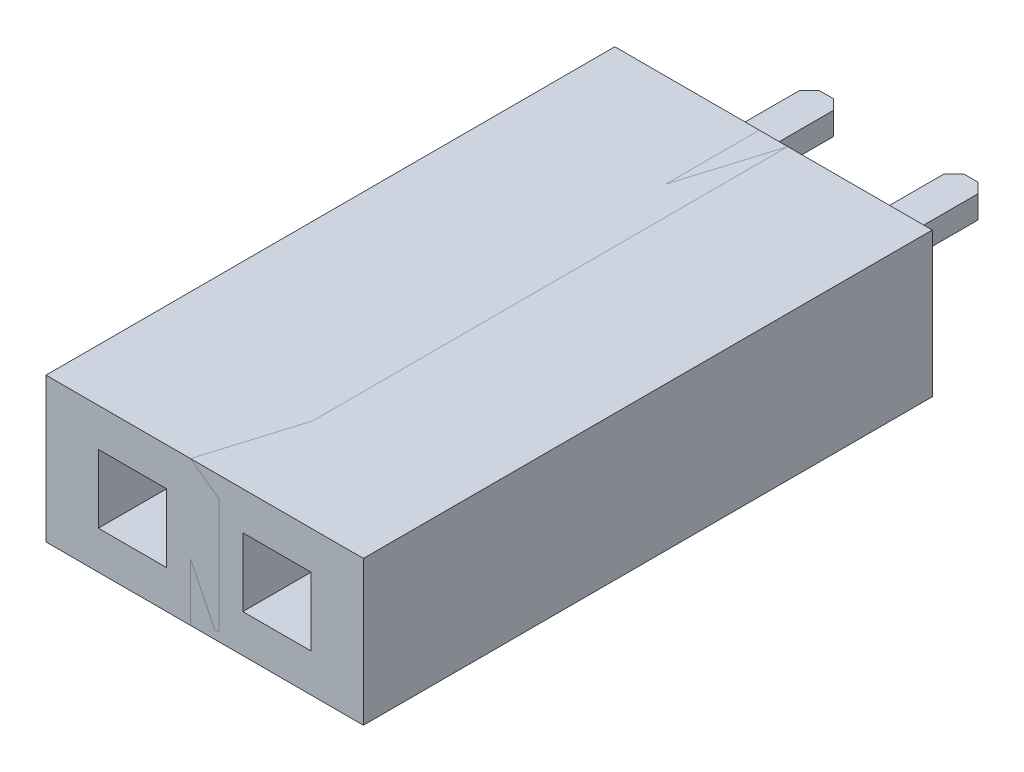
ISO-10303-21;
HEADER;
FILE_DESCRIPTION(('STEP AP214'),'2;1');
FILE_NAME('part.step','',(''),(''),'','','');
FILE_SCHEMA(('AUTOMOTIVE_DESIGN { 1 0 10303 214 1 1 1 1 }'));
ENDSEC;
DATA;
#1=APPLICATION_CONTEXT('core data for automotive mechanical design processes');
#2=APPLICATION_PROTOCOL_DEFINITION('international standard','automotive_design',2000,#1);
#3=PRODUCT_CONTEXT('',#1,'mechanical');
#4=PRODUCT('Part','Part','',(#3));
#5=PRODUCT_RELATED_PRODUCT_CATEGORY('part','',(#4));
#6=PRODUCT_DEFINITION_FORMATION('','',#4);
#7=PRODUCT_DEFINITION_CONTEXT('part definition',#1,'design');
#8=PRODUCT_DEFINITION('design','',#6,#7);
#9=PRODUCT_DEFINITION_SHAPE('','',#8);
#10=(LENGTH_UNIT() NAMED_UNIT(*) SI_UNIT(.MILLI.,.METRE.));
#11=(NAMED_UNIT(*) PLANE_ANGLE_UNIT() SI_UNIT($,.RADIAN.));
#12=(NAMED_UNIT(*) SI_UNIT($,.STERADIAN.) SOLID_ANGLE_UNIT());
#13=UNCERTAINTY_MEASURE_WITH_UNIT(LENGTH_MEASURE(1.E-05),#10,'distance_accuracy_value','');
#14=(GEOMETRIC_REPRESENTATION_CONTEXT(3) GLOBAL_UNCERTAINTY_ASSIGNED_CONTEXT((#13)) GLOBAL_UNIT_ASSIGNED_CONTEXT((#10,
#11,#12)) REPRESENTATION_CONTEXT('',''));
#15=CARTESIAN_POINT('',(0.,0.,0.));
#16=DIRECTION('',(0.,0.,1.));
#17=DIRECTION('',(1.,0.,0.));
#18=AXIS2_PLACEMENT_3D('',#15,#16,#17);
#19=CARTESIAN_POINT('',(4.06,-1.27,0.));
#20=DIRECTION('',(0.,1.,0.));
#21=DIRECTION('',(0.,0.,1.));
#22=AXIS2_PLACEMENT_3D('',#19,#20,#21);
#23=PLANE('',#22);
#24=DIRECTION('',(0.,0.,-1.));
#25=VECTOR('',#24,1.);
#26=CARTESIAN_POINT('',(1.02,-1.27,0.));
#27=LINE('',#26,#25);
#28=CARTESIAN_POINT('',(1.02,-1.27,10.));
#29=VERTEX_POINT('',#28);
#30=CARTESIAN_POINT('',(1.02,-1.27,0.));
#31=VERTEX_POINT('',#30);
#32=EDGE_CURVE('E201',#29,#31,#27,.T.);
#33=ORIENTED_EDGE('',*,*,#32,.T.);
#34=DIRECTION('',(-1.,0.,0.));
#35=VECTOR('',#34,1.);
#36=CARTESIAN_POINT('',(4.06,-1.27,0.));
#37=LINE('',#36,#35);
#38=CARTESIAN_POINT('',(4.06,-1.27,0.));
#39=VERTEX_POINT('',#38);
#40=EDGE_CURVE('E12',#39,#31,#37,.T.);
#41=ORIENTED_EDGE('',*,*,#40,.F.);
#42=DIRECTION('',(0.,0.,-1.));
#43=VECTOR('',#42,1.);
#44=CARTESIAN_POINT('',(4.06,-1.27,0.));
#45=LINE('',#44,#43);
#46=CARTESIAN_POINT('',(4.06,-1.27,10.));
#47=VERTEX_POINT('',#46);
#48=EDGE_CURVE('E207',#47,#39,#45,.T.);
#49=ORIENTED_EDGE('',*,*,#48,.F.);
#50=DIRECTION('',(-1.,0.,0.));
#51=VECTOR('',#50,1.);
#52=CARTESIAN_POINT('',(4.06,-1.27,10.));
#53=LINE('',#52,#51);
#54=EDGE_CURVE('E217',#47,#29,#53,.T.);
#55=ORIENTED_EDGE('',*,*,#54,.T.);
#56=EDGE_LOOP('',(#33,#41,#49,#55));
#57=FACE_BOUND('',#56,.T.);
#58=ADVANCED_FACE('F47',(#57),#23,.F.);
#59=CARTESIAN_POINT('',(4.06,1.27,0.));
#60=DIRECTION('',(0.,0.,1.));
#61=DIRECTION('',(1.,0.,0.));
#62=AXIS2_PLACEMENT_3D('',#59,#60,#61);
#63=PLANE('',#62);
#64=DIRECTION('',(0.,-1.,0.));
#65=VECTOR('',#64,1.);
#66=CARTESIAN_POINT('',(2.24,0.2,0.));
#67=LINE('',#66,#65);
#68=CARTESIAN_POINT('',(2.24,0.2,0.));
#69=VERTEX_POINT('',#68);
#70=CARTESIAN_POINT('',(2.24,-0.2,0.));
#71=VERTEX_POINT('',#70);
#72=EDGE_CURVE('E425',#69,#71,#67,.T.);
#73=ORIENTED_EDGE('',*,*,#72,.T.);
#74=DIRECTION('',(1.,0.,0.));
#75=VECTOR('',#74,1.);
#76=CARTESIAN_POINT('',(2.24,-0.2,0.));
#77=LINE('',#76,#75);
#78=CARTESIAN_POINT('',(2.84,-0.2,0.));
#79=VERTEX_POINT('',#78);
#80=EDGE_CURVE('E61',#71,#79,#77,.T.);
#81=ORIENTED_EDGE('',*,*,#80,.T.);
#82=DIRECTION('',(0.,-1.,0.));
#83=VECTOR('',#82,1.);
#84=CARTESIAN_POINT('',(2.84,0.2,0.));
#85=LINE('',#84,#83);
#86=CARTESIAN_POINT('',(2.84,0.2,0.));
#87=VERTEX_POINT('',#86);
#88=EDGE_CURVE('E152',#87,#79,#85,.T.);
#89=ORIENTED_EDGE('',*,*,#88,.F.);
#90=DIRECTION('',(1.,0.,0.));
#91=VECTOR('',#90,1.);
#92=CARTESIAN_POINT('',(2.24,0.2,0.));
#93=LINE('',#92,#91);
#94=EDGE_CURVE('E158',#69,#87,#93,.T.);
#95=ORIENTED_EDGE('',*,*,#94,.F.);
#96=EDGE_LOOP('',(#73,#81,#89,#95));
#97=FACE_BOUND('',#96,.T.);
#98=DIRECTION('',(0.,1.,0.));
#99=VECTOR('',#98,1.);
#100=CARTESIAN_POINT('',(1.02,1.27,0.));
#101=LINE('',#100,#99);
#102=CARTESIAN_POINT('',(1.02,1.27,0.));
#103=VERTEX_POINT('',#102);
#104=EDGE_CURVE('E220',#31,#103,#101,.T.);
#105=ORIENTED_EDGE('',*,*,#104,.T.);
#106=DIRECTION('',(-1.,0.,0.));
#107=VECTOR('',#106,1.);
#108=CARTESIAN_POINT('',(4.06,1.27,0.));
#109=LINE('',#108,#107);
#110=CARTESIAN_POINT('',(4.06,1.27,0.));
#111=VERTEX_POINT('',#110);
#112=EDGE_CURVE('E54',#111,#103,#109,.T.);
#113=ORIENTED_EDGE('',*,*,#112,.F.);
#114=DIRECTION('',(0.,1.,0.));
#115=VECTOR('',#114,1.);
#116=CARTESIAN_POINT('',(4.06,1.27,0.));
#117=LINE('',#116,#115);
#118=EDGE_CURVE('E210',#39,#111,#117,.T.);
#119=ORIENTED_EDGE('',*,*,#118,.F.);
#120=ORIENTED_EDGE('',*,*,#40,.T.);
#121=EDGE_LOOP('',(#105,#113,#119,#120));
#122=FACE_BOUND('',#121,.T.);
#123=ADVANCED_FACE('F169',(#97,#122),#63,.F.);
#124=CARTESIAN_POINT('',(4.06,1.27,0.));
#125=DIRECTION('',(0.,-1.,0.));
#126=DIRECTION('',(0.,0.,-1.));
#127=AXIS2_PLACEMENT_3D('',#124,#125,#126);
#128=PLANE('',#127);
#129=DIRECTION('',(0.,0.,1.));
#130=VECTOR('',#129,1.);
#131=CARTESIAN_POINT('',(1.02,1.27,0.));
#132=LINE('',#131,#130);
#133=CARTESIAN_POINT('',(1.02,1.27,10.));
#134=VERTEX_POINT('',#133);
#135=EDGE_CURVE('E222',#103,#134,#132,.T.);
#136=ORIENTED_EDGE('',*,*,#135,.T.);
#137=DIRECTION('',(-1.,0.,0.));
#138=VECTOR('',#137,1.);
#139=CARTESIAN_POINT('',(4.06,1.27,10.));
#140=LINE('',#139,#138);
#141=CARTESIAN_POINT('',(4.06,1.27,10.));
#142=VERTEX_POINT('',#141);
#143=EDGE_CURVE('E227',#142,#134,#140,.T.);
#144=ORIENTED_EDGE('',*,*,#143,.F.);
#145=DIRECTION('',(0.,0.,1.));
#146=VECTOR('',#145,1.);
#147=CARTESIAN_POINT('',(4.06,1.27,0.));
#148=LINE('',#147,#146);
#149=EDGE_CURVE('E213',#111,#142,#148,.T.);
#150=ORIENTED_EDGE('',*,*,#149,.F.);
#151=ORIENTED_EDGE('',*,*,#112,.T.);
#152=EDGE_LOOP('',(#136,#144,#150,#151));
#153=FACE_BOUND('',#152,.T.);
#154=ADVANCED_FACE('F234',(#153),#128,.F.);
#155=CARTESIAN_POINT('',(4.06,1.27,10.));
#156=DIRECTION('',(0.,0.,-1.));
#157=DIRECTION('',(-1.,0.,0.));
#158=AXIS2_PLACEMENT_3D('',#155,#156,#157);
#159=PLANE('',#158);
#160=DIRECTION('',(1.,0.,0.));
#161=VECTOR('',#160,1.);
#162=CARTESIAN_POINT('',(3.14,-0.6,10.));
#163=LINE('',#162,#161);
#164=CARTESIAN_POINT('',(1.94,-0.6,10.));
#165=VERTEX_POINT('',#164);
#166=CARTESIAN_POINT('',(3.14,-0.6,10.));
#167=VERTEX_POINT('',#166);
#168=EDGE_CURVE('E172',#165,#167,#163,.T.);
#169=ORIENTED_EDGE('',*,*,#168,.F.);
#170=DIRECTION('',(0.,-1.,0.));
#171=VECTOR('',#170,1.);
#172=CARTESIAN_POINT('',(1.94,-0.6,10.));
#173=LINE('',#172,#171);
#174=CARTESIAN_POINT('',(1.94,0.6,10.));
#175=VERTEX_POINT('',#174);
#176=EDGE_CURVE('E69',#175,#165,#173,.T.);
#177=ORIENTED_EDGE('',*,*,#176,.F.);
#178=DIRECTION('',(-1.,0.,0.));
#179=VECTOR('',#178,1.);
#180=CARTESIAN_POINT('',(3.14,0.6,10.));
#181=LINE('',#180,#179);
#182=CARTESIAN_POINT('',(3.14,0.6,10.));
#183=VERTEX_POINT('',#182);
#184=EDGE_CURVE('E182',#183,#175,#181,.T.);
#185=ORIENTED_EDGE('',*,*,#184,.F.);
#186=DIRECTION('',(0.,1.,0.));
#187=VECTOR('',#186,1.);
#188=CARTESIAN_POINT('',(3.14,-0.6,10.));
#189=LINE('',#188,#187);
#190=EDGE_CURVE('E194',#167,#183,#189,.T.);
#191=ORIENTED_EDGE('',*,*,#190,.F.);
#192=EDGE_LOOP('',(#169,#177,#185,#191));
#193=FACE_BOUND('',#192,.T.);
#194=DIRECTION('',(0.,-1.,0.));
#195=VECTOR('',#194,1.);
#196=CARTESIAN_POINT('',(1.02,1.27,10.));
#197=LINE('',#196,#195);
#198=EDGE_CURVE('E211',#134,#29,#197,.T.);
#199=ORIENTED_EDGE('',*,*,#198,.T.);
#200=ORIENTED_EDGE('',*,*,#54,.F.);
#201=DIRECTION('',(0.,-1.,0.));
#202=VECTOR('',#201,1.);
#203=CARTESIAN_POINT('',(4.06,1.27,10.));
#204=LINE('',#203,#202);
#205=EDGE_CURVE('E215',#142,#47,#204,.T.);
#206=ORIENTED_EDGE('',*,*,#205,.F.);
#207=ORIENTED_EDGE('',*,*,#143,.T.);
#208=EDGE_LOOP('',(#199,#200,#206,#207));
#209=FACE_BOUND('',#208,.T.);
#210=ADVANCED_FACE('F242',(#193,#209),#159,.F.);
#211=CARTESIAN_POINT('',(4.06,0.,0.));
#212=DIRECTION('',(1.,0.,0.));
#213=DIRECTION('',(0.,0.,-1.));
#214=AXIS2_PLACEMENT_3D('',#211,#212,#213);
#215=PLANE('',#214);
#216=ORIENTED_EDGE('',*,*,#48,.T.);
#217=ORIENTED_EDGE('',*,*,#118,.T.);
#218=ORIENTED_EDGE('',*,*,#149,.T.);
#219=ORIENTED_EDGE('',*,*,#205,.T.);
#220=EDGE_LOOP('',(#216,#217,#218,#219));
#221=FACE_BOUND('',#220,.T.);
#222=ADVANCED_FACE('F248',(#221),#215,.T.);
#223=CARTESIAN_POINT('',(1.02,0.,0.));
#224=DIRECTION('',(1.,0.,0.));
#225=DIRECTION('',(0.,0.,-1.));
#226=AXIS2_PLACEMENT_3D('',#223,#224,#225);
#227=PLANE('',#226);
#228=ORIENTED_EDGE('',*,*,#32,.F.);
#229=ORIENTED_EDGE('',*,*,#198,.F.);
#230=ORIENTED_EDGE('',*,*,#135,.F.);
#231=ORIENTED_EDGE('',*,*,#104,.F.);
#232=EDGE_LOOP('',(#228,#229,#230,#231));
#233=FACE_BOUND('',#232,.T.);
#234=ADVANCED_FACE('F239',(#233),#227,.F.);
#235=CARTESIAN_POINT('',(1.94,-0.6,3.));
#236=DIRECTION('',(-1.,0.,0.));
#237=DIRECTION('',(0.,-1.,0.));
#238=AXIS2_PLACEMENT_3D('',#235,#236,#237);
#239=PLANE('',#238);
#240=ORIENTED_EDGE('',*,*,#176,.T.);
#241=DIRECTION('',(0.,0.,1.));
#242=VECTOR('',#241,1.);
#243=CARTESIAN_POINT('',(1.94,-0.6,3.));
#244=LINE('',#243,#242);
#245=CARTESIAN_POINT('',(1.94,-0.6,3.));
#246=VERTEX_POINT('',#245);
#247=EDGE_CURVE('E190',#246,#165,#244,.T.);
#248=ORIENTED_EDGE('',*,*,#247,.F.);
#249=DIRECTION('',(0.,-1.,0.));
#250=VECTOR('',#249,1.);
#251=CARTESIAN_POINT('',(1.94,-0.6,3.));
#252=LINE('',#251,#250);
#253=CARTESIAN_POINT('',(1.94,0.6,3.));
#254=VERTEX_POINT('',#253);
#255=EDGE_CURVE('E178',#254,#246,#252,.T.);
#256=ORIENTED_EDGE('',*,*,#255,.F.);
#257=DIRECTION('',(0.,0.,1.));
#258=VECTOR('',#257,1.);
#259=CARTESIAN_POINT('',(1.94,0.6,3.));
#260=LINE('',#259,#258);
#261=EDGE_CURVE('E199',#254,#175,#260,.T.);
#262=ORIENTED_EDGE('',*,*,#261,.T.);
#263=EDGE_LOOP('',(#240,#248,#256,#262));
#264=FACE_BOUND('',#263,.T.);
#265=ADVANCED_FACE('F261',(#264),#239,.F.);
#266=CARTESIAN_POINT('',(3.14,0.6,3.));
#267=DIRECTION('',(0.,1.,0.));
#268=DIRECTION('',(-1.,0.,0.));
#269=AXIS2_PLACEMENT_3D('',#266,#267,#268);
#270=PLANE('',#269);
#271=ORIENTED_EDGE('',*,*,#184,.T.);
#272=ORIENTED_EDGE('',*,*,#261,.F.);
#273=DIRECTION('',(-1.,0.,0.));
#274=VECTOR('',#273,1.);
#275=CARTESIAN_POINT('',(3.14,0.6,3.));
#276=LINE('',#275,#274);
#277=CARTESIAN_POINT('',(3.14,0.6,3.));
#278=VERTEX_POINT('',#277);
#279=EDGE_CURVE('E188',#278,#254,#276,.T.);
#280=ORIENTED_EDGE('',*,*,#279,.F.);
#281=DIRECTION('',(0.,0.,1.));
#282=VECTOR('',#281,1.);
#283=CARTESIAN_POINT('',(3.14,0.6,3.));
#284=LINE('',#283,#282);
#285=EDGE_CURVE('E202',#278,#183,#284,.T.);
#286=ORIENTED_EDGE('',*,*,#285,.T.);
#287=EDGE_LOOP('',(#271,#272,#280,#286));
#288=FACE_BOUND('',#287,.T.);
#289=ADVANCED_FACE('F266',(#288),#270,.F.);
#290=CARTESIAN_POINT('',(3.14,-0.6,3.));
#291=DIRECTION('',(1.,0.,0.));
#292=DIRECTION('',(0.,1.,0.));
#293=AXIS2_PLACEMENT_3D('',#290,#291,#292);
#294=PLANE('',#293);
#295=ORIENTED_EDGE('',*,*,#190,.T.);
#296=ORIENTED_EDGE('',*,*,#285,.F.);
#297=DIRECTION('',(0.,1.,0.));
#298=VECTOR('',#297,1.);
#299=CARTESIAN_POINT('',(3.14,-0.6,3.));
#300=LINE('',#299,#298);
#301=CARTESIAN_POINT('',(3.14,-0.6,3.));
#302=VERTEX_POINT('',#301);
#303=EDGE_CURVE('E185',#302,#278,#300,.T.);
#304=ORIENTED_EDGE('',*,*,#303,.F.);
#305=DIRECTION('',(0.,0.,1.));
#306=VECTOR('',#305,1.);
#307=CARTESIAN_POINT('',(3.14,-0.6,3.));
#308=LINE('',#307,#306);
#309=EDGE_CURVE('E204',#302,#167,#308,.T.);
#310=ORIENTED_EDGE('',*,*,#309,.T.);
#311=EDGE_LOOP('',(#295,#296,#304,#310));
#312=FACE_BOUND('',#311,.T.);
#313=ADVANCED_FACE('F271',(#312),#294,.F.);
#314=CARTESIAN_POINT('',(3.14,-0.6,3.));
#315=DIRECTION('',(0.,-1.,0.));
#316=DIRECTION('',(0.,0.,-1.));
#317=AXIS2_PLACEMENT_3D('',#314,#315,#316);
#318=PLANE('',#317);
#319=ORIENTED_EDGE('',*,*,#168,.T.);
#320=ORIENTED_EDGE('',*,*,#309,.F.);
#321=DIRECTION('',(1.,0.,0.));
#322=VECTOR('',#321,1.);
#323=CARTESIAN_POINT('',(3.14,-0.6,3.));
#324=LINE('',#323,#322);
#325=EDGE_CURVE('E181',#246,#302,#324,.T.);
#326=ORIENTED_EDGE('',*,*,#325,.F.);
#327=ORIENTED_EDGE('',*,*,#247,.T.);
#328=EDGE_LOOP('',(#319,#320,#326,#327));
#329=FACE_BOUND('',#328,.T.);
#330=ADVANCED_FACE('F267',(#329),#318,.F.);
#331=CARTESIAN_POINT('',(2.54,0.,3.));
#332=DIRECTION('',(0.,0.,1.));
#333=DIRECTION('',(1.,0.,0.));
#334=AXIS2_PLACEMENT_3D('',#331,#332,#333);
#335=PLANE('',#334);
#336=ORIENTED_EDGE('',*,*,#255,.T.);
#337=ORIENTED_EDGE('',*,*,#325,.T.);
#338=ORIENTED_EDGE('',*,*,#303,.T.);
#339=ORIENTED_EDGE('',*,*,#279,.T.);
#340=EDGE_LOOP('',(#336,#337,#338,#339));
#341=FACE_BOUND('',#340,.T.);
#342=ADVANCED_FACE('F270',(#341),#335,.T.);
#343=CARTESIAN_POINT('',(2.84,0.2,0.));
#344=DIRECTION('',(-1.,0.,0.));
#345=DIRECTION('',(0.,0.,1.));
#346=AXIS2_PLACEMENT_3D('',#343,#344,#345);
#347=PLANE('',#346);
#348=DIRECTION('',(0.,0.,-1.));
#349=VECTOR('',#348,1.);
#350=CARTESIAN_POINT('',(2.84,-0.2,0.));
#351=LINE('',#350,#349);
#352=CARTESIAN_POINT('',(2.84,-0.2,-2.02426406871193));
#353=VERTEX_POINT('',#352);
#354=EDGE_CURVE('E449',#79,#353,#351,.T.);
#355=ORIENTED_EDGE('',*,*,#354,.T.);
#356=DIRECTION('',(0.,-1.,0.));
#357=VECTOR('',#356,1.);
#358=CARTESIAN_POINT('',(2.84,0.2,-2.02426406871193));
#359=LINE('',#358,#357);
#360=CARTESIAN_POINT('',(2.84,0.2,-2.02426406871193));
#361=VERTEX_POINT('',#360);
#362=EDGE_CURVE('E154',#361,#353,#359,.T.);
#363=ORIENTED_EDGE('',*,*,#362,.F.);
#364=DIRECTION('',(0.,0.,-1.));
#365=VECTOR('',#364,1.);
#366=CARTESIAN_POINT('',(2.84,0.2,0.));
#367=LINE('',#366,#365);
#368=EDGE_CURVE('E148',#87,#361,#367,.T.);
#369=ORIENTED_EDGE('',*,*,#368,.F.);
#370=ORIENTED_EDGE('',*,*,#88,.T.);
#371=EDGE_LOOP('',(#355,#363,#369,#370));
#372=FACE_BOUND('',#371,.T.);
#373=ADVANCED_FACE('F150',(#372),#347,.F.);
#374=CARTESIAN_POINT('',(2.84,0.2,-2.02426406871193));
#375=DIRECTION('',(-0.707106781186548,0.,0.707106781186547));
#376=DIRECTION('',(0.707106781186547,0.,0.707106781186548));
#377=AXIS2_PLACEMENT_3D('',#374,#375,#376);
#378=PLANE('',#377);
#379=DIRECTION('',(-0.707106781186547,0.,-0.707106781186548));
#380=VECTOR('',#379,1.);
#381=CARTESIAN_POINT('',(2.84,-0.2,-2.02426406871193));
#382=LINE('',#381,#380);
#383=CARTESIAN_POINT('',(2.66426406871193,-0.2,-2.2));
#384=VERTEX_POINT('',#383);
#385=EDGE_CURVE('E447',#353,#384,#382,.T.);
#386=ORIENTED_EDGE('',*,*,#385,.T.);
#387=DIRECTION('',(0.,-1.,0.));
#388=VECTOR('',#387,1.);
#389=CARTESIAN_POINT('',(2.66426406871193,0.2,-2.2));
#390=LINE('',#389,#388);
#391=CARTESIAN_POINT('',(2.66426406871193,0.2,-2.2));
#392=VERTEX_POINT('',#391);
#393=EDGE_CURVE('E174',#392,#384,#390,.T.);
#394=ORIENTED_EDGE('',*,*,#393,.F.);
#395=DIRECTION('',(-0.707106781186547,0.,-0.707106781186548));
#396=VECTOR('',#395,1.);
#397=CARTESIAN_POINT('',(2.84,0.2,-2.02426406871193));
#398=LINE('',#397,#396);
#399=EDGE_CURVE('E157',#361,#392,#398,.T.);
#400=ORIENTED_EDGE('',*,*,#399,.F.);
#401=ORIENTED_EDGE('',*,*,#362,.T.);
#402=EDGE_LOOP('',(#386,#394,#400,#401));
#403=FACE_BOUND('',#402,.T.);
#404=ADVANCED_FACE('F284',(#403),#378,.F.);
#405=CARTESIAN_POINT('',(2.41573593128807,0.2,-2.2));
#406=DIRECTION('',(0.,0.,1.));
#407=DIRECTION('',(1.,0.,0.));
#408=AXIS2_PLACEMENT_3D('',#405,#406,#407);
#409=PLANE('',#408);
#410=DIRECTION('',(-1.,0.,0.));
#411=VECTOR('',#410,1.);
#412=CARTESIAN_POINT('',(2.41573593128807,-0.2,-2.2));
#413=LINE('',#412,#411);
#414=CARTESIAN_POINT('',(2.41573593128807,-0.2,-2.2));
#415=VERTEX_POINT('',#414);
#416=EDGE_CURVE('E444',#384,#415,#413,.T.);
#417=ORIENTED_EDGE('',*,*,#416,.T.);
#418=DIRECTION('',(0.,-1.,0.));
#419=VECTOR('',#418,1.);
#420=CARTESIAN_POINT('',(2.41573593128807,0.2,-2.2));
#421=LINE('',#420,#419);
#422=CARTESIAN_POINT('',(2.41573593128807,0.2,-2.2));
#423=VERTEX_POINT('',#422);
#424=EDGE_CURVE('E432',#423,#415,#421,.T.);
#425=ORIENTED_EDGE('',*,*,#424,.F.);
#426=DIRECTION('',(-1.,0.,0.));
#427=VECTOR('',#426,1.);
#428=CARTESIAN_POINT('',(2.41573593128807,0.2,-2.2));
#429=LINE('',#428,#427);
#430=EDGE_CURVE('E445',#392,#423,#429,.T.);
#431=ORIENTED_EDGE('',*,*,#430,.F.);
#432=ORIENTED_EDGE('',*,*,#393,.T.);
#433=EDGE_LOOP('',(#417,#425,#431,#432));
#434=FACE_BOUND('',#433,.T.);
#435=ADVANCED_FACE('F287',(#434),#409,.F.);
#436=CARTESIAN_POINT('',(2.24,0.2,-2.02426406871193));
#437=DIRECTION('',(0.707106781186548,0.,0.707106781186546));
#438=DIRECTION('',(0.707106781186547,0.,-0.707106781186549));
#439=AXIS2_PLACEMENT_3D('',#436,#437,#438);
#440=PLANE('',#439);
#441=DIRECTION('',(-0.707106781186546,0.,0.707106781186548));
#442=VECTOR('',#441,1.);
#443=CARTESIAN_POINT('',(2.24,-0.2,-2.02426406871193));
#444=LINE('',#443,#442);
#445=CARTESIAN_POINT('',(2.24,-0.2,-2.02426406871193));
#446=VERTEX_POINT('',#445);
#447=EDGE_CURVE('E429',#415,#446,#444,.T.);
#448=ORIENTED_EDGE('',*,*,#447,.T.);
#449=DIRECTION('',(0.,-1.,0.));
#450=VECTOR('',#449,1.);
#451=CARTESIAN_POINT('',(2.24,0.2,-2.02426406871193));
#452=LINE('',#451,#450);
#453=CARTESIAN_POINT('',(2.24,0.2,-2.02426406871193));
#454=VERTEX_POINT('',#453);
#455=EDGE_CURVE('E427',#454,#446,#452,.T.);
#456=ORIENTED_EDGE('',*,*,#455,.F.);
#457=DIRECTION('',(-0.707106781186546,0.,0.707106781186548));
#458=VECTOR('',#457,1.);
#459=CARTESIAN_POINT('',(2.24,0.2,-2.02426406871193));
#460=LINE('',#459,#458);
#461=EDGE_CURVE('E434',#423,#454,#460,.T.);
#462=ORIENTED_EDGE('',*,*,#461,.F.);
#463=ORIENTED_EDGE('',*,*,#424,.T.);
#464=EDGE_LOOP('',(#448,#456,#462,#463));
#465=FACE_BOUND('',#464,.T.);
#466=ADVANCED_FACE('F291',(#465),#440,.F.);
#467=CARTESIAN_POINT('',(2.24,0.2,0.));
#468=DIRECTION('',(1.,0.,0.));
#469=DIRECTION('',(0.,0.,-1.));
#470=AXIS2_PLACEMENT_3D('',#467,#468,#469);
#471=PLANE('',#470);
#472=DIRECTION('',(0.,0.,1.));
#473=VECTOR('',#472,1.);
#474=CARTESIAN_POINT('',(2.24,-0.2,0.));
#475=LINE('',#474,#473);
#476=EDGE_CURVE('E167',#446,#71,#475,.T.);
#477=ORIENTED_EDGE('',*,*,#476,.T.);
#478=ORIENTED_EDGE('',*,*,#72,.F.);
#479=DIRECTION('',(0.,0.,1.));
#480=VECTOR('',#479,1.);
#481=CARTESIAN_POINT('',(2.24,0.2,0.));
#482=LINE('',#481,#480);
#483=EDGE_CURVE('E163',#454,#69,#482,.T.);
#484=ORIENTED_EDGE('',*,*,#483,.F.);
#485=ORIENTED_EDGE('',*,*,#455,.T.);
#486=EDGE_LOOP('',(#477,#478,#484,#485));
#487=FACE_BOUND('',#486,.T.);
#488=ADVANCED_FACE('F295',(#487),#471,.F.);
#489=CARTESIAN_POINT('',(2.54,0.2,0.));
#490=DIRECTION('',(0.,1.,0.));
#491=DIRECTION('',(0.,0.,1.));
#492=AXIS2_PLACEMENT_3D('',#489,#490,#491);
#493=PLANE('',#492);
#494=ORIENTED_EDGE('',*,*,#94,.T.);
#495=ORIENTED_EDGE('',*,*,#368,.T.);
#496=ORIENTED_EDGE('',*,*,#399,.T.);
#497=ORIENTED_EDGE('',*,*,#430,.T.);
#498=ORIENTED_EDGE('',*,*,#461,.T.);
#499=ORIENTED_EDGE('',*,*,#483,.T.);
#500=EDGE_LOOP('',(#494,#495,#496,#497,#498,#499));
#501=FACE_BOUND('',#500,.T.);
#502=ADVANCED_FACE('F161',(#501),#493,.T.);
#503=CARTESIAN_POINT('',(2.54,-0.2,0.));
#504=DIRECTION('',(0.,1.,0.));
#505=DIRECTION('',(0.,0.,1.));
#506=AXIS2_PLACEMENT_3D('',#503,#504,#505);
#507=PLANE('',#506);
#508=ORIENTED_EDGE('',*,*,#80,.F.);
#509=ORIENTED_EDGE('',*,*,#476,.F.);
#510=ORIENTED_EDGE('',*,*,#447,.F.);
#511=ORIENTED_EDGE('',*,*,#416,.F.);
#512=ORIENTED_EDGE('',*,*,#385,.F.);
#513=ORIENTED_EDGE('',*,*,#354,.F.);
#514=EDGE_LOOP('',(#508,#509,#510,#511,#512,#513));
#515=FACE_BOUND('',#514,.T.);
#516=ADVANCED_FACE('F300',(#515),#507,.F.);
#517=CLOSED_SHELL('',(#58,#123,#154,#210,#222,#234,#265,#289,#313,#330,#342,#373,#404,#435,#466,
#488,#502,#516));
#518=MANIFOLD_SOLID_BREP('B2',#517);
#519=CARTESIAN_POINT('',(1.52,-1.27,0.));
#520=DIRECTION('',(0.,1.,0.));
#521=DIRECTION('',(0.,0.,1.));
#522=AXIS2_PLACEMENT_3D('',#519,#520,#521);
#523=PLANE('',#522);
#524=DIRECTION('',(0.,0.,-1.));
#525=VECTOR('',#524,1.);
#526=CARTESIAN_POINT('',(-1.52,-1.27,0.));
#527=LINE('',#526,#525);
#528=CARTESIAN_POINT('',(-1.52,-1.27,10.));
#529=VERTEX_POINT('',#528);
#530=CARTESIAN_POINT('',(-1.52,-1.27,0.));
#531=VERTEX_POINT('',#530);
#532=EDGE_CURVE('E621',#529,#531,#527,.T.);
#533=ORIENTED_EDGE('',*,*,#532,.T.);
#534=DIRECTION('',(-1.,0.,0.));
#535=VECTOR('',#534,1.);
#536=CARTESIAN_POINT('',(1.52,-1.27,0.));
#537=LINE('',#536,#535);
#538=CARTESIAN_POINT('',(1.52,-1.27,0.));
#539=VERTEX_POINT('',#538);
#540=EDGE_CURVE('E45',#539,#531,#537,.T.);
#541=ORIENTED_EDGE('',*,*,#540,.F.);
#542=DIRECTION('',(0.,0.,-1.));
#543=VECTOR('',#542,1.);
#544=CARTESIAN_POINT('',(1.52,-1.27,0.));
#545=LINE('',#544,#543);
#546=CARTESIAN_POINT('',(1.52,-1.27,10.));
#547=VERTEX_POINT('',#546);
#548=EDGE_CURVE('E627',#547,#539,#545,.T.);
#549=ORIENTED_EDGE('',*,*,#548,.F.);
#550=DIRECTION('',(-1.,0.,0.));
#551=VECTOR('',#550,1.);
#552=CARTESIAN_POINT('',(1.52,-1.27,10.));
#553=LINE('',#552,#551);
#554=EDGE_CURVE('E637',#547,#529,#553,.T.);
#555=ORIENTED_EDGE('',*,*,#554,.T.);
#556=EDGE_LOOP('',(#533,#541,#549,#555));
#557=FACE_BOUND('',#556,.T.);
#558=ADVANCED_FACE('F467',(#557),#523,.F.);
#559=CARTESIAN_POINT('',(1.52,1.27,0.));
#560=DIRECTION('',(0.,0.,1.));
#561=DIRECTION('',(1.,0.,0.));
#562=AXIS2_PLACEMENT_3D('',#559,#560,#561);
#563=PLANE('',#562);
#564=DIRECTION('',(0.,-1.,0.));
#565=VECTOR('',#564,1.);
#566=CARTESIAN_POINT('',(-0.3,0.2,0.));
#567=LINE('',#566,#565);
#568=CARTESIAN_POINT('',(-0.3,0.2,0.));
#569=VERTEX_POINT('',#568);
#570=CARTESIAN_POINT('',(-0.3,-0.2,0.));
#571=VERTEX_POINT('',#570);
#572=EDGE_CURVE('E831',#569,#571,#567,.T.);
#573=ORIENTED_EDGE('',*,*,#572,.T.);
#574=DIRECTION('',(1.,0.,0.));
#575=VECTOR('',#574,1.);
#576=CARTESIAN_POINT('',(-0.3,-0.2,0.));
#577=LINE('',#576,#575);
#578=CARTESIAN_POINT('',(0.3,-0.2,0.));
#579=VERTEX_POINT('',#578);
#580=EDGE_CURVE('E481',#571,#579,#577,.T.);
#581=ORIENTED_EDGE('',*,*,#580,.T.);
#582=DIRECTION('',(0.,-1.,0.));
#583=VECTOR('',#582,1.);
#584=CARTESIAN_POINT('',(0.3,0.2,0.));
#585=LINE('',#584,#583);
#586=CARTESIAN_POINT('',(0.3,0.2,0.));
#587=VERTEX_POINT('',#586);
#588=EDGE_CURVE('E572',#587,#579,#585,.T.);
#589=ORIENTED_EDGE('',*,*,#588,.F.);
#590=DIRECTION('',(1.,0.,0.));
#591=VECTOR('',#590,1.);
#592=CARTESIAN_POINT('',(-0.3,0.2,0.));
#593=LINE('',#592,#591);
#594=EDGE_CURVE('E578',#569,#587,#593,.T.);
#595=ORIENTED_EDGE('',*,*,#594,.F.);
#596=EDGE_LOOP('',(#573,#581,#589,#595));
#597=FACE_BOUND('',#596,.T.);
#598=DIRECTION('',(0.,1.,0.));
#599=VECTOR('',#598,1.);
#600=CARTESIAN_POINT('',(-1.52,1.27,0.));
#601=LINE('',#600,#599);
#602=CARTESIAN_POINT('',(-1.52,1.27,0.));
#603=VERTEX_POINT('',#602);
#604=EDGE_CURVE('E640',#531,#603,#601,.T.);
#605=ORIENTED_EDGE('',*,*,#604,.T.);
#606=DIRECTION('',(-1.,0.,0.));
#607=VECTOR('',#606,1.);
#608=CARTESIAN_POINT('',(1.52,1.27,0.));
#609=LINE('',#608,#607);
#610=CARTESIAN_POINT('',(1.52,1.27,0.));
#611=VERTEX_POINT('',#610);
#612=EDGE_CURVE('E474',#611,#603,#609,.T.);
#613=ORIENTED_EDGE('',*,*,#612,.F.);
#614=DIRECTION('',(0.,1.,0.));
#615=VECTOR('',#614,1.);
#616=CARTESIAN_POINT('',(1.52,1.27,0.));
#617=LINE('',#616,#615);
#618=EDGE_CURVE('E630',#539,#611,#617,.T.);
#619=ORIENTED_EDGE('',*,*,#618,.F.);
#620=ORIENTED_EDGE('',*,*,#540,.T.);
#621=EDGE_LOOP('',(#605,#613,#619,#620));
#622=FACE_BOUND('',#621,.T.);
#623=ADVANCED_FACE('F589',(#597,#622),#563,.F.);
#624=CARTESIAN_POINT('',(1.52,1.27,0.));
#625=DIRECTION('',(0.,-1.,0.));
#626=DIRECTION('',(0.,0.,-1.));
#627=AXIS2_PLACEMENT_3D('',#624,#625,#626);
#628=PLANE('',#627);
#629=DIRECTION('',(0.,0.,1.));
#630=VECTOR('',#629,1.);
#631=CARTESIAN_POINT('',(-1.52,1.27,0.));
#632=LINE('',#631,#630);
#633=CARTESIAN_POINT('',(-1.52,1.27,10.));
#634=VERTEX_POINT('',#633);
#635=EDGE_CURVE('E642',#603,#634,#632,.T.);
#636=ORIENTED_EDGE('',*,*,#635,.T.);
#637=DIRECTION('',(-1.,0.,0.));
#638=VECTOR('',#637,1.);
#639=CARTESIAN_POINT('',(1.52,1.27,10.));
#640=LINE('',#639,#638);
#641=CARTESIAN_POINT('',(1.52,1.27,10.));
#642=VERTEX_POINT('',#641);
#643=EDGE_CURVE('E647',#642,#634,#640,.T.);
#644=ORIENTED_EDGE('',*,*,#643,.F.);
#645=DIRECTION('',(0.,0.,1.));
#646=VECTOR('',#645,1.);
#647=CARTESIAN_POINT('',(1.52,1.27,0.));
#648=LINE('',#647,#646);
#649=EDGE_CURVE('E633',#611,#642,#648,.T.);
#650=ORIENTED_EDGE('',*,*,#649,.F.);
#651=ORIENTED_EDGE('',*,*,#612,.T.);
#652=EDGE_LOOP('',(#636,#644,#650,#651));
#653=FACE_BOUND('',#652,.T.);
#654=ADVANCED_FACE('F654',(#653),#628,.F.);
#655=CARTESIAN_POINT('',(1.52,1.27,10.));
#656=DIRECTION('',(0.,0.,-1.));
#657=DIRECTION('',(-1.,0.,0.));
#658=AXIS2_PLACEMENT_3D('',#655,#656,#657);
#659=PLANE('',#658);
#660=DIRECTION('',(1.,0.,0.));
#661=VECTOR('',#660,1.);
#662=CARTESIAN_POINT('',(0.6,-0.6,10.));
#663=LINE('',#662,#661);
#664=CARTESIAN_POINT('',(-0.6,-0.6,10.));
#665=VERTEX_POINT('',#664);
#666=CARTESIAN_POINT('',(0.6,-0.6,10.));
#667=VERTEX_POINT('',#666);
#668=EDGE_CURVE('E592',#665,#667,#663,.T.);
#669=ORIENTED_EDGE('',*,*,#668,.F.);
#670=DIRECTION('',(0.,-1.,0.));
#671=VECTOR('',#670,1.);
#672=CARTESIAN_POINT('',(-0.6,-0.6,10.));
#673=LINE('',#672,#671);
#674=CARTESIAN_POINT('',(-0.6,0.6,10.));
#675=VERTEX_POINT('',#674);
#676=EDGE_CURVE('E489',#675,#665,#673,.T.);
#677=ORIENTED_EDGE('',*,*,#676,.F.);
#678=DIRECTION('',(-1.,0.,0.));
#679=VECTOR('',#678,1.);
#680=CARTESIAN_POINT('',(0.6,0.6,10.));
#681=LINE('',#680,#679);
#682=CARTESIAN_POINT('',(0.6,0.6,10.));
#683=VERTEX_POINT('',#682);
#684=EDGE_CURVE('E602',#683,#675,#681,.T.);
#685=ORIENTED_EDGE('',*,*,#684,.F.);
#686=DIRECTION('',(0.,1.,0.));
#687=VECTOR('',#686,1.);
#688=CARTESIAN_POINT('',(0.6,-0.6,10.));
#689=LINE('',#688,#687);
#690=EDGE_CURVE('E614',#667,#683,#689,.T.);
#691=ORIENTED_EDGE('',*,*,#690,.F.);
#692=EDGE_LOOP('',(#669,#677,#685,#691));
#693=FACE_BOUND('',#692,.T.);
#694=DIRECTION('',(0.,-1.,0.));
#695=VECTOR('',#694,1.);
#696=CARTESIAN_POINT('',(-1.52,1.27,10.));
#697=LINE('',#696,#695);
#698=EDGE_CURVE('E631',#634,#529,#697,.T.);
#699=ORIENTED_EDGE('',*,*,#698,.T.);
#700=ORIENTED_EDGE('',*,*,#554,.F.);
#701=DIRECTION('',(0.,-1.,0.));
#702=VECTOR('',#701,1.);
#703=CARTESIAN_POINT('',(1.52,1.27,10.));
#704=LINE('',#703,#702);
#705=EDGE_CURVE('E635',#642,#547,#704,.T.);
#706=ORIENTED_EDGE('',*,*,#705,.F.);
#707=ORIENTED_EDGE('',*,*,#643,.T.);
#708=EDGE_LOOP('',(#699,#700,#706,#707));
#709=FACE_BOUND('',#708,.T.);
#710=ADVANCED_FACE('F662',(#693,#709),#659,.F.);
#711=CARTESIAN_POINT('',(1.52,0.,0.));
#712=DIRECTION('',(1.,0.,0.));
#713=DIRECTION('',(0.,0.,-1.));
#714=AXIS2_PLACEMENT_3D('',#711,#712,#713);
#715=PLANE('',#714);
#716=ORIENTED_EDGE('',*,*,#548,.T.);
#717=ORIENTED_EDGE('',*,*,#618,.T.);
#718=ORIENTED_EDGE('',*,*,#649,.T.);
#719=ORIENTED_EDGE('',*,*,#705,.T.);
#720=EDGE_LOOP('',(#716,#717,#718,#719));
#721=FACE_BOUND('',#720,.T.);
#722=ADVANCED_FACE('F668',(#721),#715,.T.);
#723=CARTESIAN_POINT('',(-1.52,0.,0.));
#724=DIRECTION('',(1.,0.,0.));
#725=DIRECTION('',(0.,0.,-1.));
#726=AXIS2_PLACEMENT_3D('',#723,#724,#725);
#727=PLANE('',#726);
#728=ORIENTED_EDGE('',*,*,#532,.F.);
#729=ORIENTED_EDGE('',*,*,#698,.F.);
#730=ORIENTED_EDGE('',*,*,#635,.F.);
#731=ORIENTED_EDGE('',*,*,#604,.F.);
#732=EDGE_LOOP('',(#728,#729,#730,#731));
#733=FACE_BOUND('',#732,.T.);
#734=ADVANCED_FACE('F659',(#733),#727,.F.);
#735=CARTESIAN_POINT('',(-0.6,-0.6,3.));
#736=DIRECTION('',(-1.,0.,0.));
#737=DIRECTION('',(0.,-1.,0.));
#738=AXIS2_PLACEMENT_3D('',#735,#736,#737);
#739=PLANE('',#738);
#740=ORIENTED_EDGE('',*,*,#676,.T.);
#741=DIRECTION('',(0.,0.,1.));
#742=VECTOR('',#741,1.);
#743=CARTESIAN_POINT('',(-0.6,-0.6,3.));
#744=LINE('',#743,#742);
#745=CARTESIAN_POINT('',(-0.6,-0.6,3.));
#746=VERTEX_POINT('',#745);
#747=EDGE_CURVE('E610',#746,#665,#744,.T.);
#748=ORIENTED_EDGE('',*,*,#747,.F.);
#749=DIRECTION('',(0.,-1.,0.));
#750=VECTOR('',#749,1.);
#751=CARTESIAN_POINT('',(-0.6,-0.6,3.));
#752=LINE('',#751,#750);
#753=CARTESIAN_POINT('',(-0.6,0.6,3.));
#754=VERTEX_POINT('',#753);
#755=EDGE_CURVE('E598',#754,#746,#752,.T.);
#756=ORIENTED_EDGE('',*,*,#755,.F.);
#757=DIRECTION('',(0.,0.,1.));
#758=VECTOR('',#757,1.);
#759=CARTESIAN_POINT('',(-0.6,0.6,3.));
#760=LINE('',#759,#758);
#761=EDGE_CURVE('E619',#754,#675,#760,.T.);
#762=ORIENTED_EDGE('',*,*,#761,.T.);
#763=EDGE_LOOP('',(#740,#748,#756,#762));
#764=FACE_BOUND('',#763,.T.);
#765=ADVANCED_FACE('F681',(#764),#739,.F.);
#766=CARTESIAN_POINT('',(0.6,0.6,3.));
#767=DIRECTION('',(0.,1.,0.));
#768=DIRECTION('',(-1.,0.,0.));
#769=AXIS2_PLACEMENT_3D('',#766,#767,#768);
#770=PLANE('',#769);
#771=ORIENTED_EDGE('',*,*,#684,.T.);
#772=ORIENTED_EDGE('',*,*,#761,.F.);
#773=DIRECTION('',(-1.,0.,0.));
#774=VECTOR('',#773,1.);
#775=CARTESIAN_POINT('',(0.6,0.6,3.));
#776=LINE('',#775,#774);
#777=CARTESIAN_POINT('',(0.6,0.6,3.));
#778=VERTEX_POINT('',#777);
#779=EDGE_CURVE('E608',#778,#754,#776,.T.);
#780=ORIENTED_EDGE('',*,*,#779,.F.);
#781=DIRECTION('',(0.,0.,1.));
#782=VECTOR('',#781,1.);
#783=CARTESIAN_POINT('',(0.6,0.6,3.));
#784=LINE('',#783,#782);
#785=EDGE_CURVE('E622',#778,#683,#784,.T.);
#786=ORIENTED_EDGE('',*,*,#785,.T.);
#787=EDGE_LOOP('',(#771,#772,#780,#786));
#788=FACE_BOUND('',#787,.T.);
#789=ADVANCED_FACE('F686',(#788),#770,.F.);
#790=CARTESIAN_POINT('',(0.6,-0.6,3.));
#791=DIRECTION('',(1.,0.,0.));
#792=DIRECTION('',(0.,1.,0.));
#793=AXIS2_PLACEMENT_3D('',#790,#791,#792);
#794=PLANE('',#793);
#795=ORIENTED_EDGE('',*,*,#690,.T.);
#796=ORIENTED_EDGE('',*,*,#785,.F.);
#797=DIRECTION('',(0.,1.,0.));
#798=VECTOR('',#797,1.);
#799=CARTESIAN_POINT('',(0.6,-0.6,3.));
#800=LINE('',#799,#798);
#801=CARTESIAN_POINT('',(0.6,-0.6,3.));
#802=VERTEX_POINT('',#801);
#803=EDGE_CURVE('E605',#802,#778,#800,.T.);
#804=ORIENTED_EDGE('',*,*,#803,.F.);
#805=DIRECTION('',(0.,0.,1.));
#806=VECTOR('',#805,1.);
#807=CARTESIAN_POINT('',(0.6,-0.6,3.));
#808=LINE('',#807,#806);
#809=EDGE_CURVE('E624',#802,#667,#808,.T.);
#810=ORIENTED_EDGE('',*,*,#809,.T.);
#811=EDGE_LOOP('',(#795,#796,#804,#810));
#812=FACE_BOUND('',#811,.T.);
#813=ADVANCED_FACE('F691',(#812),#794,.F.);
#814=CARTESIAN_POINT('',(0.6,-0.6,3.));
#815=DIRECTION('',(0.,-1.,0.));
#816=DIRECTION('',(0.,0.,-1.));
#817=AXIS2_PLACEMENT_3D('',#814,#815,#816);
#818=PLANE('',#817);
#819=ORIENTED_EDGE('',*,*,#668,.T.);
#820=ORIENTED_EDGE('',*,*,#809,.F.);
#821=DIRECTION('',(1.,0.,0.));
#822=VECTOR('',#821,1.);
#823=CARTESIAN_POINT('',(0.6,-0.6,3.));
#824=LINE('',#823,#822);
#825=EDGE_CURVE('E601',#746,#802,#824,.T.);
#826=ORIENTED_EDGE('',*,*,#825,.F.);
#827=ORIENTED_EDGE('',*,*,#747,.T.);
#828=EDGE_LOOP('',(#819,#820,#826,#827));
#829=FACE_BOUND('',#828,.T.);
#830=ADVANCED_FACE('F687',(#829),#818,.F.);
#831=CARTESIAN_POINT('',(0.,0.,3.));
#832=DIRECTION('',(0.,0.,1.));
#833=DIRECTION('',(1.,0.,0.));
#834=AXIS2_PLACEMENT_3D('',#831,#832,#833);
#835=PLANE('',#834);
#836=ORIENTED_EDGE('',*,*,#755,.T.);
#837=ORIENTED_EDGE('',*,*,#825,.T.);
#838=ORIENTED_EDGE('',*,*,#803,.T.);
#839=ORIENTED_EDGE('',*,*,#779,.T.);
#840=EDGE_LOOP('',(#836,#837,#838,#839));
#841=FACE_BOUND('',#840,.T.);
#842=ADVANCED_FACE('F690',(#841),#835,.T.);
#843=CARTESIAN_POINT('',(0.3,0.2,0.));
#844=DIRECTION('',(-1.,0.,0.));
#845=DIRECTION('',(0.,0.,1.));
#846=AXIS2_PLACEMENT_3D('',#843,#844,#845);
#847=PLANE('',#846);
#848=DIRECTION('',(0.,0.,-1.));
#849=VECTOR('',#848,1.);
#850=CARTESIAN_POINT('',(0.3,-0.2,0.));
#851=LINE('',#850,#849);
#852=CARTESIAN_POINT('',(0.299999999999999,-0.2,-2.02426406871193));
#853=VERTEX_POINT('',#852);
#854=EDGE_CURVE('E855',#579,#853,#851,.T.);
#855=ORIENTED_EDGE('',*,*,#854,.T.);
#856=DIRECTION('',(0.,-1.,0.));
#857=VECTOR('',#856,1.);
#858=CARTESIAN_POINT('',(0.299999999999999,0.2,-2.02426406871193));
#859=LINE('',#858,#857);
#860=CARTESIAN_POINT('',(0.299999999999999,0.2,-2.02426406871193));
#861=VERTEX_POINT('',#860);
#862=EDGE_CURVE('E574',#861,#853,#859,.T.);
#863=ORIENTED_EDGE('',*,*,#862,.F.);
#864=DIRECTION('',(0.,0.,-1.));
#865=VECTOR('',#864,1.);
#866=CARTESIAN_POINT('',(0.3,0.2,0.));
#867=LINE('',#866,#865);
#868=EDGE_CURVE('E568',#587,#861,#867,.T.);
#869=ORIENTED_EDGE('',*,*,#868,.F.);
#870=ORIENTED_EDGE('',*,*,#588,.T.);
#871=EDGE_LOOP('',(#855,#863,#869,#870));
#872=FACE_BOUND('',#871,.T.);
#873=ADVANCED_FACE('F570',(#872),#847,.F.);
#874=CARTESIAN_POINT('',(0.299999999999999,0.2,-2.02426406871193));
#875=DIRECTION('',(-0.707106781186548,0.,0.707106781186547));
#876=DIRECTION('',(0.707106781186547,0.,0.707106781186548));
#877=AXIS2_PLACEMENT_3D('',#874,#875,#876);
#878=PLANE('',#877);
#879=DIRECTION('',(-0.707106781186547,0.,-0.707106781186548));
#880=VECTOR('',#879,1.);
#881=CARTESIAN_POINT('',(0.299999999999999,-0.2,-2.02426406871193));
#882=LINE('',#881,#880);
#883=CARTESIAN_POINT('',(0.124264068711928,-0.2,-2.2));
#884=VERTEX_POINT('',#883);
#885=EDGE_CURVE('E853',#853,#884,#882,.T.);
#886=ORIENTED_EDGE('',*,*,#885,.T.);
#887=DIRECTION('',(0.,-1.,0.));
#888=VECTOR('',#887,1.);
#889=CARTESIAN_POINT('',(0.124264068711928,0.2,-2.2));
#890=LINE('',#889,#888);
#891=CARTESIAN_POINT('',(0.124264068711928,0.2,-2.2));
#892=VERTEX_POINT('',#891);
#893=EDGE_CURVE('E594',#892,#884,#890,.T.);
#894=ORIENTED_EDGE('',*,*,#893,.F.);
#895=DIRECTION('',(-0.707106781186547,0.,-0.707106781186548));
#896=VECTOR('',#895,1.);
#897=CARTESIAN_POINT('',(0.299999999999999,0.2,-2.02426406871193));
#898=LINE('',#897,#896);
#899=EDGE_CURVE('E577',#861,#892,#898,.T.);
#900=ORIENTED_EDGE('',*,*,#899,.F.);
#901=ORIENTED_EDGE('',*,*,#862,.T.);
#902=EDGE_LOOP('',(#886,#894,#900,#901));
#903=FACE_BOUND('',#902,.T.);
#904=ADVANCED_FACE('F704',(#903),#878,.F.);
#905=CARTESIAN_POINT('',(-0.124264068711929,0.2,-2.2));
#906=DIRECTION('',(0.,0.,1.));
#907=DIRECTION('',(1.,0.,0.));
#908=AXIS2_PLACEMENT_3D('',#905,#906,#907);
#909=PLANE('',#908);
#910=DIRECTION('',(-1.,0.,0.));
#911=VECTOR('',#910,1.);
#912=CARTESIAN_POINT('',(-0.124264068711929,-0.2,-2.2));
#913=LINE('',#912,#911);
#914=CARTESIAN_POINT('',(-0.124264068711929,-0.2,-2.2));
#915=VERTEX_POINT('',#914);
#916=EDGE_CURVE('E850',#884,#915,#913,.T.);
#917=ORIENTED_EDGE('',*,*,#916,.T.);
#918=DIRECTION('',(0.,-1.,0.));
#919=VECTOR('',#918,1.);
#920=CARTESIAN_POINT('',(-0.124264068711929,0.2,-2.2));
#921=LINE('',#920,#919);
#922=CARTESIAN_POINT('',(-0.124264068711929,0.2,-2.2));
#923=VERTEX_POINT('',#922);
#924=EDGE_CURVE('E838',#923,#915,#921,.T.);
#925=ORIENTED_EDGE('',*,*,#924,.F.);
#926=DIRECTION('',(-1.,0.,0.));
#927=VECTOR('',#926,1.);
#928=CARTESIAN_POINT('',(-0.124264068711929,0.2,-2.2));
#929=LINE('',#928,#927);
#930=EDGE_CURVE('E851',#892,#923,#929,.T.);
#931=ORIENTED_EDGE('',*,*,#930,.F.);
#932=ORIENTED_EDGE('',*,*,#893,.T.);
#933=EDGE_LOOP('',(#917,#925,#931,#932));
#934=FACE_BOUND('',#933,.T.);
#935=ADVANCED_FACE('F707',(#934),#909,.F.);
#936=CARTESIAN_POINT('',(-0.3,0.2,-2.02426406871193));
#937=DIRECTION('',(0.707106781186548,0.,0.707106781186546));
#938=DIRECTION('',(0.707106781186547,0.,-0.707106781186549));
#939=AXIS2_PLACEMENT_3D('',#936,#937,#938);
#940=PLANE('',#939);
#941=DIRECTION('',(-0.707106781186546,0.,0.707106781186548));
#942=VECTOR('',#941,1.);
#943=CARTESIAN_POINT('',(-0.3,-0.2,-2.02426406871193));
#944=LINE('',#943,#942);
#945=CARTESIAN_POINT('',(-0.3,-0.2,-2.02426406871193));
#946=VERTEX_POINT('',#945);
#947=EDGE_CURVE('E835',#915,#946,#944,.T.);
#948=ORIENTED_EDGE('',*,*,#947,.T.);
#949=DIRECTION('',(0.,-1.,0.));
#950=VECTOR('',#949,1.);
#951=CARTESIAN_POINT('',(-0.3,0.2,-2.02426406871193));
#952=LINE('',#951,#950);
#953=CARTESIAN_POINT('',(-0.3,0.2,-2.02426406871193));
#954=VERTEX_POINT('',#953);
#955=EDGE_CURVE('E833',#954,#946,#952,.T.);
#956=ORIENTED_EDGE('',*,*,#955,.F.);
#957=DIRECTION('',(-0.707106781186546,0.,0.707106781186548));
#958=VECTOR('',#957,1.);
#959=CARTESIAN_POINT('',(-0.3,0.2,-2.02426406871193));
#960=LINE('',#959,#958);
#961=EDGE_CURVE('E840',#923,#954,#960,.T.);
#962=ORIENTED_EDGE('',*,*,#961,.F.);
#963=ORIENTED_EDGE('',*,*,#924,.T.);
#964=EDGE_LOOP('',(#948,#956,#962,#963));
#965=FACE_BOUND('',#964,.T.);
#966=ADVANCED_FACE('F711',(#965),#940,.F.);
#967=CARTESIAN_POINT('',(-0.3,0.2,0.));
#968=DIRECTION('',(1.,0.,0.));
#969=DIRECTION('',(0.,0.,-1.));
#970=AXIS2_PLACEMENT_3D('',#967,#968,#969);
#971=PLANE('',#970);
#972=DIRECTION('',(0.,0.,1.));
#973=VECTOR('',#972,1.);
#974=CARTESIAN_POINT('',(-0.3,-0.2,0.));
#975=LINE('',#974,#973);
#976=EDGE_CURVE('E587',#946,#571,#975,.T.);
#977=ORIENTED_EDGE('',*,*,#976,.T.);
#978=ORIENTED_EDGE('',*,*,#572,.F.);
#979=DIRECTION('',(0.,0.,1.));
#980=VECTOR('',#979,1.);
#981=CARTESIAN_POINT('',(-0.3,0.2,0.));
#982=LINE('',#981,#980);
#983=EDGE_CURVE('E583',#954,#569,#982,.T.);
#984=ORIENTED_EDGE('',*,*,#983,.F.);
#985=ORIENTED_EDGE('',*,*,#955,.T.);
#986=EDGE_LOOP('',(#977,#978,#984,#985));
#987=FACE_BOUND('',#986,.T.);
#988=ADVANCED_FACE('F715',(#987),#971,.F.);
#989=CARTESIAN_POINT('',(0.,0.2,0.));
#990=DIRECTION('',(0.,1.,0.));
#991=DIRECTION('',(0.,0.,1.));
#992=AXIS2_PLACEMENT_3D('',#989,#990,#991);
#993=PLANE('',#992);
#994=ORIENTED_EDGE('',*,*,#594,.T.);
#995=ORIENTED_EDGE('',*,*,#868,.T.);
#996=ORIENTED_EDGE('',*,*,#899,.T.);
#997=ORIENTED_EDGE('',*,*,#930,.T.);
#998=ORIENTED_EDGE('',*,*,#961,.T.);
#999=ORIENTED_EDGE('',*,*,#983,.T.);
#1000=EDGE_LOOP('',(#994,#995,#996,#997,#998,#999));
#1001=FACE_BOUND('',#1000,.T.);
#1002=ADVANCED_FACE('F581',(#1001),#993,.T.);
#1003=CARTESIAN_POINT('',(0.,-0.2,0.));
#1004=DIRECTION('',(0.,1.,0.));
#1005=DIRECTION('',(0.,0.,1.));
#1006=AXIS2_PLACEMENT_3D('',#1003,#1004,#1005);
#1007=PLANE('',#1006);
#1008=ORIENTED_EDGE('',*,*,#580,.F.);
#1009=ORIENTED_EDGE('',*,*,#976,.F.);
#1010=ORIENTED_EDGE('',*,*,#947,.F.);
#1011=ORIENTED_EDGE('',*,*,#916,.F.);
#1012=ORIENTED_EDGE('',*,*,#885,.F.);
#1013=ORIENTED_EDGE('',*,*,#854,.F.);
#1014=EDGE_LOOP('',(#1008,#1009,#1010,#1011,#1012,#1013));
#1015=FACE_BOUND('',#1014,.T.);
#1016=ADVANCED_FACE('F720',(#1015),#1007,.F.);
#1017=CLOSED_SHELL('',(#558,#623,#654,#710,#722,#734,#765,#789,#813,#830,#842,#873,#904,#935,
#966,#988,#1002,#1016));
#1018=MANIFOLD_SOLID_BREP('B6',#1017);
#1019=ADVANCED_BREP_SHAPE_REPRESENTATION('',(#18,#518,#1018),#14);
#1020=SHAPE_DEFINITION_REPRESENTATION(#9,#1019);
ENDSEC;
END-ISO-10303-21;
